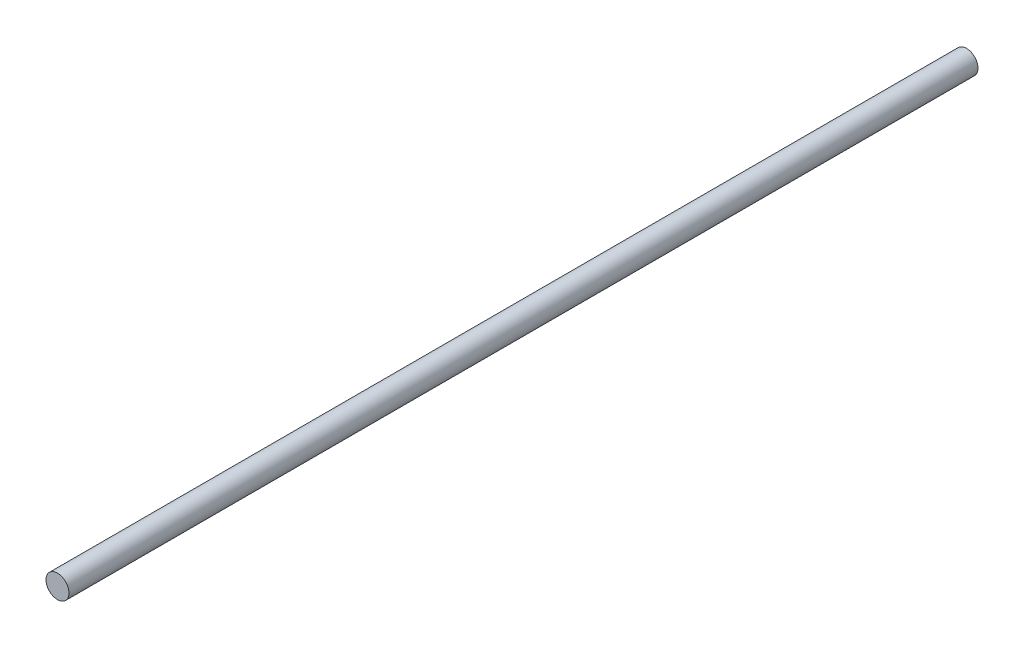
ISO-10303-21;
HEADER;
FILE_DESCRIPTION(('STEP AP214'),'2;1');
FILE_NAME('part.step','',(''),(''),'','','');
FILE_SCHEMA(('AUTOMOTIVE_DESIGN { 1 0 10303 214 1 1 1 1 }'));
ENDSEC;
DATA;
#1=APPLICATION_CONTEXT('core data for automotive mechanical design processes');
#2=APPLICATION_PROTOCOL_DEFINITION('international standard','automotive_design',2000,#1);
#3=PRODUCT_CONTEXT('',#1,'mechanical');
#4=PRODUCT('Part','Part','',(#3));
#5=PRODUCT_RELATED_PRODUCT_CATEGORY('part','',(#4));
#6=PRODUCT_DEFINITION_FORMATION('','',#4);
#7=PRODUCT_DEFINITION_CONTEXT('part definition',#1,'design');
#8=PRODUCT_DEFINITION('design','',#6,#7);
#9=PRODUCT_DEFINITION_SHAPE('','',#8);
#10=(LENGTH_UNIT() NAMED_UNIT(*) SI_UNIT(.MILLI.,.METRE.));
#11=(NAMED_UNIT(*) PLANE_ANGLE_UNIT() SI_UNIT($,.RADIAN.));
#12=(NAMED_UNIT(*) SI_UNIT($,.STERADIAN.) SOLID_ANGLE_UNIT());
#13=UNCERTAINTY_MEASURE_WITH_UNIT(LENGTH_MEASURE(1.E-05),#10,'distance_accuracy_value','');
#14=(GEOMETRIC_REPRESENTATION_CONTEXT(3) GLOBAL_UNCERTAINTY_ASSIGNED_CONTEXT((#13)) GLOBAL_UNIT_ASSIGNED_CONTEXT((#10,
#11,#12)) REPRESENTATION_CONTEXT('',''));
#15=CARTESIAN_POINT('',(0.,0.,0.));
#16=DIRECTION('',(0.,0.,1.));
#17=DIRECTION('',(1.,0.,0.));
#18=AXIS2_PLACEMENT_3D('',#15,#16,#17);
#19=CARTESIAN_POINT('',(0.,0.,316.));
#20=DIRECTION('',(0.,0.,-1.));
#21=DIRECTION('',(-1.,0.,0.));
#22=AXIS2_PLACEMENT_3D('',#19,#20,#21);
#23=CYLINDRICAL_SURFACE('',#22,4.);
#24=CARTESIAN_POINT('',(0.,0.,316.));
#25=DIRECTION('',(0.,0.,1.));
#26=DIRECTION('',(1.,0.,0.));
#27=AXIS2_PLACEMENT_3D('',#24,#25,#26);
#28=CIRCLE('',#27,4.);
#29=CARTESIAN_POINT('',(4.,0.,316.));
#30=VERTEX_POINT('',#29);
#31=EDGE_CURVE('E10',#30,#30,#28,.T.);
#32=ORIENTED_EDGE('',*,*,#31,.F.);
#33=EDGE_LOOP('',(#32));
#34=FACE_BOUND('',#33,.T.);
#35=CARTESIAN_POINT('',(0.,0.,0.));
#36=DIRECTION('',(0.,0.,1.));
#37=DIRECTION('',(1.,0.,0.));
#38=AXIS2_PLACEMENT_3D('',#35,#36,#37);
#39=CIRCLE('',#38,4.);
#40=CARTESIAN_POINT('',(4.,0.,0.));
#41=VERTEX_POINT('',#40);
#42=EDGE_CURVE('E47',#41,#41,#39,.T.);
#43=ORIENTED_EDGE('',*,*,#42,.T.);
#44=EDGE_LOOP('',(#43));
#45=FACE_BOUND('',#44,.T.);
#46=ADVANCED_FACE('F44',(#34,#45),#23,.T.);
#47=CARTESIAN_POINT('',(0.,0.,316.));
#48=DIRECTION('',(0.,0.,1.));
#49=DIRECTION('',(1.,0.,0.));
#50=AXIS2_PLACEMENT_3D('',#47,#48,#49);
#51=PLANE('',#50);
#52=ORIENTED_EDGE('',*,*,#31,.T.);
#53=EDGE_LOOP('',(#52));
#54=FACE_BOUND('',#53,.T.);
#55=ADVANCED_FACE('F61',(#54),#51,.T.);
#56=CARTESIAN_POINT('',(0.,0.,0.));
#57=DIRECTION('',(0.,0.,1.));
#58=DIRECTION('',(1.,0.,0.));
#59=AXIS2_PLACEMENT_3D('',#56,#57,#58);
#60=PLANE('',#59);
#61=ORIENTED_EDGE('',*,*,#42,.F.);
#62=EDGE_LOOP('',(#61));
#63=FACE_BOUND('',#62,.T.);
#64=ADVANCED_FACE('F59',(#63),#60,.F.);
#65=CLOSED_SHELL('',(#46,#55,#64));
#66=MANIFOLD_SOLID_BREP('B2',#65);
#67=ADVANCED_BREP_SHAPE_REPRESENTATION('',(#18,#66),#14);
#68=SHAPE_DEFINITION_REPRESENTATION(#9,#67);
ENDSEC;
END-ISO-10303-21;
